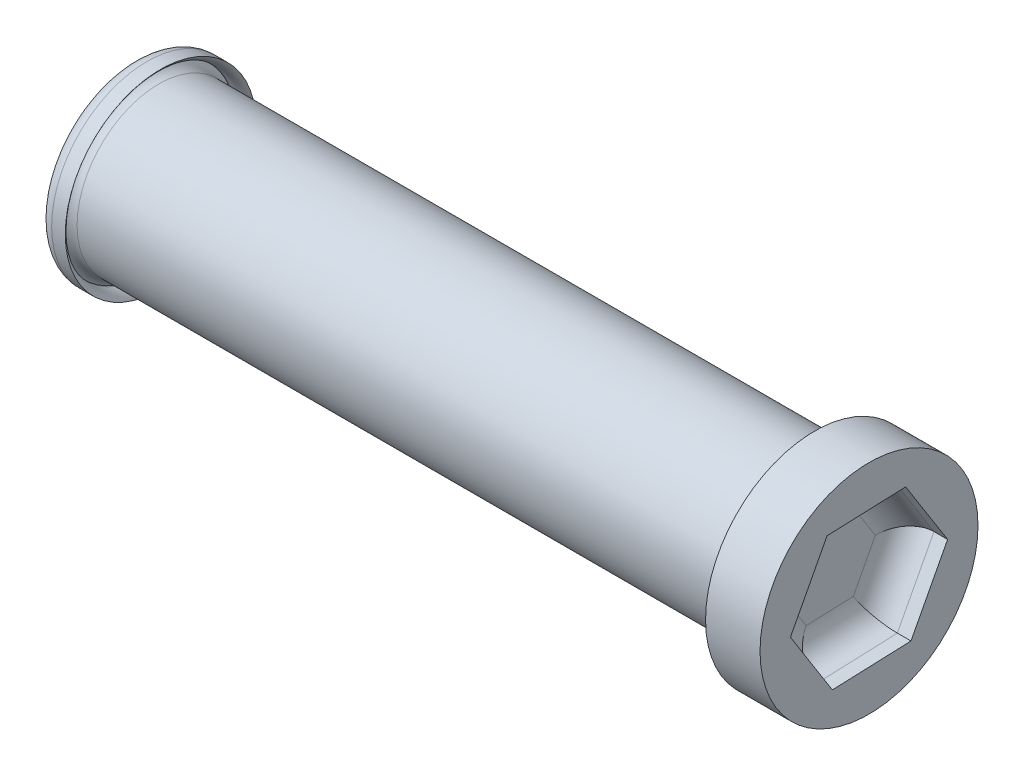
ISO-10303-21;
HEADER;
FILE_DESCRIPTION(('STEP AP214'),'2;1');
FILE_NAME('part.step','',(''),(''),'','','');
FILE_SCHEMA(('AUTOMOTIVE_DESIGN { 1 0 10303 214 1 1 1 1 }'));
ENDSEC;
DATA;
#1=APPLICATION_CONTEXT('core data for automotive mechanical design processes');
#2=APPLICATION_PROTOCOL_DEFINITION('international standard','automotive_design',2000,#1);
#3=PRODUCT_CONTEXT('',#1,'mechanical');
#4=PRODUCT('Part','Part','',(#3));
#5=PRODUCT_RELATED_PRODUCT_CATEGORY('part','',(#4));
#6=PRODUCT_DEFINITION_FORMATION('','',#4);
#7=PRODUCT_DEFINITION_CONTEXT('part definition',#1,'design');
#8=PRODUCT_DEFINITION('design','',#6,#7);
#9=PRODUCT_DEFINITION_SHAPE('','',#8);
#10=(LENGTH_UNIT() NAMED_UNIT(*) SI_UNIT(.MILLI.,.METRE.));
#11=(NAMED_UNIT(*) PLANE_ANGLE_UNIT() SI_UNIT($,.RADIAN.));
#12=(NAMED_UNIT(*) SI_UNIT($,.STERADIAN.) SOLID_ANGLE_UNIT());
#13=UNCERTAINTY_MEASURE_WITH_UNIT(LENGTH_MEASURE(1.E-05),#10,'distance_accuracy_value','');
#14=(GEOMETRIC_REPRESENTATION_CONTEXT(3) GLOBAL_UNCERTAINTY_ASSIGNED_CONTEXT((#13)) GLOBAL_UNIT_ASSIGNED_CONTEXT((#10,
#11,#12)) REPRESENTATION_CONTEXT('',''));
#15=CARTESIAN_POINT('',(0.,0.,0.));
#16=DIRECTION('',(0.,0.,1.));
#17=DIRECTION('',(1.,0.,0.));
#18=AXIS2_PLACEMENT_3D('',#15,#16,#17);
#19=CARTESIAN_POINT('',(0.,0.,0.));
#20=DIRECTION('',(1.,0.,0.));
#21=DIRECTION('',(0.,0.,-1.));
#22=AXIS2_PLACEMENT_3D('',#19,#20,#21);
#23=PLANE('',#22);
#24=CARTESIAN_POINT('',(0.,0.,0.));
#25=DIRECTION('',(1.,0.,0.));
#26=DIRECTION('',(0.,0.,-1.));
#27=AXIS2_PLACEMENT_3D('',#24,#25,#26);
#28=CIRCLE('',#27,3.5);
#29=CARTESIAN_POINT('',(0.,0.,-3.5));
#30=VERTEX_POINT('',#29);
#31=EDGE_CURVE('E155',#30,#30,#28,.T.);
#32=ORIENTED_EDGE('',*,*,#31,.T.);
#33=EDGE_LOOP('',(#32));
#34=FACE_BOUND('',#33,.T.);
#35=CARTESIAN_POINT('',(0.,0.,0.));
#36=DIRECTION('',(1.,0.,0.));
#37=DIRECTION('',(0.,0.,-1.));
#38=AXIS2_PLACEMENT_3D('',#35,#36,#37);
#39=CIRCLE('',#38,4.);
#40=CARTESIAN_POINT('',(0.,0.,-4.));
#41=VERTEX_POINT('',#40);
#42=EDGE_CURVE('E146',#41,#41,#39,.T.);
#43=ORIENTED_EDGE('',*,*,#42,.F.);
#44=EDGE_LOOP('',(#43));
#45=FACE_BOUND('',#44,.T.);
#46=ADVANCED_FACE('F32',(#34,#45),#23,.F.);
#47=CARTESIAN_POINT('',(2.,0.,0.));
#48=DIRECTION('',(1.,0.,0.));
#49=DIRECTION('',(0.,0.,-1.));
#50=AXIS2_PLACEMENT_3D('',#47,#48,#49);
#51=CYLINDRICAL_SURFACE('',#50,4.);
#52=CARTESIAN_POINT('',(2.,0.,0.));
#53=DIRECTION('',(1.,0.,0.));
#54=DIRECTION('',(0.,0.,-1.));
#55=AXIS2_PLACEMENT_3D('',#52,#53,#54);
#56=CIRCLE('',#55,4.);
#57=CARTESIAN_POINT('',(2.,0.,-4.));
#58=VERTEX_POINT('',#57);
#59=EDGE_CURVE('E137',#58,#58,#56,.T.);
#60=ORIENTED_EDGE('',*,*,#59,.F.);
#61=EDGE_LOOP('',(#60));
#62=FACE_BOUND('',#61,.T.);
#63=ORIENTED_EDGE('',*,*,#42,.T.);
#64=EDGE_LOOP('',(#63));
#65=FACE_BOUND('',#64,.T.);
#66=ADVANCED_FACE('F272',(#62,#65),#51,.T.);
#67=CARTESIAN_POINT('',(2.,4.,0.));
#68=DIRECTION('',(-1.,0.,0.));
#69=DIRECTION('',(0.,0.,1.));
#70=AXIS2_PLACEMENT_3D('',#67,#68,#69);
#71=PLANE('',#70);
#72=DIRECTION('',(0.,-0.0391108686359707,0.999234877270875));
#73=VECTOR('',#72,1.);
#74=CARTESIAN_POINT('',(2.,2.55453886951523,-1.34449414185008));
#75=LINE('',#74,#73);
#76=CARTESIAN_POINT('',(2.,2.55453886951523,-1.34449414185008));
#77=VERTEX_POINT('',#76);
#78=CARTESIAN_POINT('',(2.,2.44163551683914,1.54004848502993));
#79=VERTEX_POINT('',#78);
#80=EDGE_CURVE('E113',#77,#79,#75,.T.);
#81=ORIENTED_EDGE('',*,*,#80,.F.);
#82=DIRECTION('',(0.,0.845807353746018,0.533488444438264));
#83=VECTOR('',#82,1.);
#84=CARTESIAN_POINT('',(2.,0.112903352676089,-2.88454262688001));
#85=LINE('',#84,#83);
#86=CARTESIAN_POINT('',(2.,0.112903352676089,-2.88454262688001));
#87=VERTEX_POINT('',#86);
#88=EDGE_CURVE('E118',#87,#77,#85,.T.);
#89=ORIENTED_EDGE('',*,*,#88,.F.);
#90=DIRECTION('',(0.,0.884918222381988,-0.465746432832611));
#91=VECTOR('',#90,1.);
#92=CARTESIAN_POINT('',(2.,-2.44163551683914,-1.54004848502993));
#93=LINE('',#92,#91);
#94=CARTESIAN_POINT('',(2.,-2.44163551683914,-1.54004848502993));
#95=VERTEX_POINT('',#94);
#96=EDGE_CURVE('E132',#95,#87,#93,.T.);
#97=ORIENTED_EDGE('',*,*,#96,.F.);
#98=DIRECTION('',(0.,0.0391108686359705,-0.999234877270875));
#99=VECTOR('',#98,1.);
#100=CARTESIAN_POINT('',(2.,-2.55453886951523,1.34449414185008));
#101=LINE('',#100,#99);
#102=CARTESIAN_POINT('',(2.,-2.55453886951523,1.34449414185008));
#103=VERTEX_POINT('',#102);
#104=EDGE_CURVE('E126',#103,#95,#101,.T.);
#105=ORIENTED_EDGE('',*,*,#104,.F.);
#106=DIRECTION('',(0.,-0.845807353746018,-0.533488444438264));
#107=VECTOR('',#106,1.);
#108=CARTESIAN_POINT('',(2.,-0.112903352676088,2.88454262688001));
#109=LINE('',#108,#107);
#110=CARTESIAN_POINT('',(2.,-0.112903352676088,2.88454262688001));
#111=VERTEX_POINT('',#110);
#112=EDGE_CURVE('E124',#111,#103,#109,.T.);
#113=ORIENTED_EDGE('',*,*,#112,.F.);
#114=DIRECTION('',(0.,-0.884918222381988,0.465746432832611));
#115=VECTOR('',#114,1.);
#116=CARTESIAN_POINT('',(2.,2.44163551683914,1.54004848502993));
#117=LINE('',#116,#115);
#118=EDGE_CURVE('E106',#79,#111,#117,.T.);
#119=ORIENTED_EDGE('',*,*,#118,.F.);
#120=EDGE_LOOP('',(#81,#89,#97,#105,#113,#119));
#121=FACE_BOUND('',#120,.T.);
#122=ORIENTED_EDGE('',*,*,#59,.T.);
#123=EDGE_LOOP('',(#122));
#124=FACE_BOUND('',#123,.T.);
#125=ADVANCED_FACE('F120',(#121,#124),#71,.F.);
#126=CARTESIAN_POINT('',(-24.,0.,0.));
#127=DIRECTION('',(1.,0.,0.));
#128=DIRECTION('',(0.,0.,-1.));
#129=AXIS2_PLACEMENT_3D('',#126,#127,#128);
#130=CYLINDRICAL_SURFACE('',#129,3.);
#131=CARTESIAN_POINT('',(-24.0669872981078,0.,0.));
#132=DIRECTION('',(-1.,0.,0.));
#133=DIRECTION('',(0.,0.,1.));
#134=AXIS2_PLACEMENT_3D('',#131,#132,#133);
#135=CIRCLE('',#134,3.);
#136=CARTESIAN_POINT('',(-24.0669872981078,0.,3.));
#137=VERTEX_POINT('',#136);
#138=EDGE_CURVE('E152',#137,#137,#135,.F.);
#139=ORIENTED_EDGE('',*,*,#138,.T.);
#140=EDGE_LOOP('',(#139));
#141=FACE_BOUND('',#140,.T.);
#142=CARTESIAN_POINT('',(-0.5,0.,0.));
#143=DIRECTION('',(1.,0.,0.));
#144=DIRECTION('',(0.,0.,-1.));
#145=AXIS2_PLACEMENT_3D('',#142,#143,#144);
#146=CIRCLE('',#145,3.);
#147=CARTESIAN_POINT('',(-0.5,0.,-3.));
#148=VERTEX_POINT('',#147);
#149=EDGE_CURVE('E149',#148,#148,#146,.F.);
#150=ORIENTED_EDGE('',*,*,#149,.T.);
#151=EDGE_LOOP('',(#150));
#152=FACE_BOUND('',#151,.T.);
#153=ADVANCED_FACE('F376',(#141,#152),#130,.T.);
#154=CARTESIAN_POINT('',(0.5,0.112903352676089,-2.88454262688001));
#155=DIRECTION('',(0.,0.533488444438264,-0.845807353746018));
#156=DIRECTION('',(0.,0.845807353746018,0.533488444438264));
#157=AXIS2_PLACEMENT_3D('',#154,#155,#156);
#158=PLANE('',#157);
#159=DIRECTION('',(1.,0.,0.));
#160=VECTOR('',#159,1.);
#161=CARTESIAN_POINT('',(0.5,2.55453886951523,-1.34449414185008));
#162=LINE('',#161,#160);
#163=CARTESIAN_POINT('',(1.5,2.55453886951523,-1.34449414185008));
#164=VERTEX_POINT('',#163);
#165=EDGE_CURVE('E110',#164,#77,#162,.T.);
#166=ORIENTED_EDGE('',*,*,#165,.F.);
#167=DIRECTION('',(0.,0.845807353746018,0.533488444438264));
#168=VECTOR('',#167,1.);
#169=CARTESIAN_POINT('',(1.5,0.112903352676089,-2.88454262688001));
#170=LINE('',#169,#168);
#171=CARTESIAN_POINT('',(1.5,0.112903352676089,-2.88454262688001));
#172=VERTEX_POINT('',#171);
#173=EDGE_CURVE('E11',#164,#172,#170,.F.);
#174=ORIENTED_EDGE('',*,*,#173,.T.);
#175=DIRECTION('',(1.,0.,0.));
#176=VECTOR('',#175,1.);
#177=CARTESIAN_POINT('',(0.5,0.112903352676089,-2.88454262688001));
#178=LINE('',#177,#176);
#179=EDGE_CURVE('E135',#172,#87,#178,.T.);
#180=ORIENTED_EDGE('',*,*,#179,.T.);
#181=ORIENTED_EDGE('',*,*,#88,.T.);
#182=EDGE_LOOP('',(#166,#174,#180,#181));
#183=FACE_BOUND('',#182,.T.);
#184=ADVANCED_FACE('F225',(#183),#158,.F.);
#185=CARTESIAN_POINT('',(0.5,-2.44163551683914,-1.54004848502993));
#186=DIRECTION('',(0.,-0.465746432832611,-0.884918222381988));
#187=DIRECTION('',(0.,0.884918222381988,-0.465746432832611));
#188=AXIS2_PLACEMENT_3D('',#185,#186,#187);
#189=PLANE('',#188);
#190=ORIENTED_EDGE('',*,*,#179,.F.);
#191=DIRECTION('',(0.,0.884918222381988,-0.465746432832611));
#192=VECTOR('',#191,1.);
#193=CARTESIAN_POINT('',(1.5,-2.44163551683914,-1.54004848502993));
#194=LINE('',#193,#192);
#195=CARTESIAN_POINT('',(1.5,-2.44163551683914,-1.54004848502993));
#196=VERTEX_POINT('',#195);
#197=EDGE_CURVE('E186',#172,#196,#194,.F.);
#198=ORIENTED_EDGE('',*,*,#197,.T.);
#199=DIRECTION('',(1.,0.,0.));
#200=VECTOR('',#199,1.);
#201=CARTESIAN_POINT('',(0.5,-2.44163551683914,-1.54004848502993));
#202=LINE('',#201,#200);
#203=EDGE_CURVE('E138',#196,#95,#202,.T.);
#204=ORIENTED_EDGE('',*,*,#203,.T.);
#205=ORIENTED_EDGE('',*,*,#96,.T.);
#206=EDGE_LOOP('',(#190,#198,#204,#205));
#207=FACE_BOUND('',#206,.T.);
#208=ADVANCED_FACE('F230',(#207),#189,.F.);
#209=CARTESIAN_POINT('',(0.5,-2.55453886951523,1.34449414185008));
#210=DIRECTION('',(0.,-0.999234877270875,-0.0391108686359705));
#211=DIRECTION('',(0.,0.0391108686359705,-0.999234877270875));
#212=AXIS2_PLACEMENT_3D('',#209,#210,#211);
#213=PLANE('',#212);
#214=ORIENTED_EDGE('',*,*,#203,.F.);
#215=DIRECTION('',(0.,0.0391108686359705,-0.999234877270875));
#216=VECTOR('',#215,1.);
#217=CARTESIAN_POINT('',(1.5,-2.55453886951523,1.34449414185008));
#218=LINE('',#217,#216);
#219=CARTESIAN_POINT('',(1.5,-2.55453886951523,1.34449414185008));
#220=VERTEX_POINT('',#219);
#221=EDGE_CURVE('E189',#196,#220,#218,.F.);
#222=ORIENTED_EDGE('',*,*,#221,.T.);
#223=DIRECTION('',(1.,0.,0.));
#224=VECTOR('',#223,1.);
#225=CARTESIAN_POINT('',(0.5,-2.55453886951523,1.34449414185008));
#226=LINE('',#225,#224);
#227=EDGE_CURVE('E140',#220,#103,#226,.T.);
#228=ORIENTED_EDGE('',*,*,#227,.T.);
#229=ORIENTED_EDGE('',*,*,#104,.T.);
#230=EDGE_LOOP('',(#214,#222,#228,#229));
#231=FACE_BOUND('',#230,.T.);
#232=ADVANCED_FACE('F234',(#231),#213,.F.);
#233=CARTESIAN_POINT('',(0.5,-0.112903352676088,2.88454262688001));
#234=DIRECTION('',(0.,-0.533488444438264,0.845807353746018));
#235=DIRECTION('',(0.,-0.845807353746018,-0.533488444438264));
#236=AXIS2_PLACEMENT_3D('',#233,#234,#235);
#237=PLANE('',#236);
#238=ORIENTED_EDGE('',*,*,#227,.F.);
#239=DIRECTION('',(0.,-0.845807353746018,-0.533488444438264));
#240=VECTOR('',#239,1.);
#241=CARTESIAN_POINT('',(1.5,-0.112903352676088,2.88454262688001));
#242=LINE('',#241,#240);
#243=CARTESIAN_POINT('',(1.5,-0.112903352676088,2.88454262688001));
#244=VERTEX_POINT('',#243);
#245=EDGE_CURVE('E191',#220,#244,#242,.F.);
#246=ORIENTED_EDGE('',*,*,#245,.T.);
#247=DIRECTION('',(1.,0.,0.));
#248=VECTOR('',#247,1.);
#249=CARTESIAN_POINT('',(0.5,-0.112903352676088,2.88454262688001));
#250=LINE('',#249,#248);
#251=EDGE_CURVE('E109',#244,#111,#250,.T.);
#252=ORIENTED_EDGE('',*,*,#251,.T.);
#253=ORIENTED_EDGE('',*,*,#112,.T.);
#254=EDGE_LOOP('',(#238,#246,#252,#253));
#255=FACE_BOUND('',#254,.T.);
#256=ADVANCED_FACE('F238',(#255),#237,.F.);
#257=CARTESIAN_POINT('',(0.5,2.44163551683914,1.54004848502993));
#258=DIRECTION('',(0.,0.465746432832611,0.884918222381988));
#259=DIRECTION('',(0.,-0.884918222381989,0.465746432832611));
#260=AXIS2_PLACEMENT_3D('',#257,#258,#259);
#261=PLANE('',#260);
#262=ORIENTED_EDGE('',*,*,#251,.F.);
#263=DIRECTION('',(0.,-0.884918222381989,0.465746432832611));
#264=VECTOR('',#263,1.);
#265=CARTESIAN_POINT('',(1.5,2.44163551683914,1.54004848502993));
#266=LINE('',#265,#264);
#267=CARTESIAN_POINT('',(1.5,2.44163551683914,1.54004848502993));
#268=VERTEX_POINT('',#267);
#269=EDGE_CURVE('E56',#244,#268,#266,.F.);
#270=ORIENTED_EDGE('',*,*,#269,.T.);
#271=DIRECTION('',(1.,0.,0.));
#272=VECTOR('',#271,1.);
#273=CARTESIAN_POINT('',(0.5,2.44163551683914,1.54004848502993));
#274=LINE('',#273,#272);
#275=EDGE_CURVE('E102',#268,#79,#274,.T.);
#276=ORIENTED_EDGE('',*,*,#275,.T.);
#277=ORIENTED_EDGE('',*,*,#118,.T.);
#278=EDGE_LOOP('',(#262,#270,#276,#277));
#279=FACE_BOUND('',#278,.T.);
#280=ADVANCED_FACE('F104',(#279),#261,.F.);
#281=CARTESIAN_POINT('',(0.5,2.55453886951523,-1.34449414185008));
#282=DIRECTION('',(0.,0.999234877270875,0.0391108686359707));
#283=DIRECTION('',(0.,-0.0391108686359707,0.999234877270875));
#284=AXIS2_PLACEMENT_3D('',#281,#282,#283);
#285=PLANE('',#284);
#286=ORIENTED_EDGE('',*,*,#275,.F.);
#287=DIRECTION('',(0.,-0.0391108686359707,0.999234877270875));
#288=VECTOR('',#287,1.);
#289=CARTESIAN_POINT('',(1.5,2.55453886951523,-1.34449414185008));
#290=LINE('',#289,#288);
#291=EDGE_CURVE('E41',#268,#164,#290,.F.);
#292=ORIENTED_EDGE('',*,*,#291,.T.);
#293=ORIENTED_EDGE('',*,*,#165,.T.);
#294=ORIENTED_EDGE('',*,*,#80,.T.);
#295=EDGE_LOOP('',(#286,#292,#293,#294));
#296=FACE_BOUND('',#295,.T.);
#297=ADVANCED_FACE('F114',(#296),#285,.F.);
#298=CARTESIAN_POINT('',(0.5,0.,0.));
#299=DIRECTION('',(1.,0.,0.));
#300=DIRECTION('',(0.,0.,-1.));
#301=AXIS2_PLACEMENT_3D('',#298,#299,#300);
#302=PLANE('',#301);
#303=DIRECTION('',(0.,0.0391108686359705,-0.999234877270875));
#304=VECTOR('',#303,1.);
#305=CARTESIAN_POINT('',(0.5,-1.49885231590631,-0.0586663029539557));
#306=LINE('',#305,#304);
#307=CARTESIAN_POINT('',(0.5,-1.53272332170914,0.806696485110047));
#308=VERTEX_POINT('',#307);
#309=CARTESIAN_POINT('',(0.5,-1.46498131010349,-0.924029091017958));
#310=VERTEX_POINT('',#309);
#311=EDGE_CURVE('E181',#308,#310,#306,.T.);
#312=ORIENTED_EDGE('',*,*,#311,.T.);
#313=DIRECTION('',(0.,0.884918222381988,-0.465746432832611));
#314=VECTOR('',#313,1.);
#315=CARTESIAN_POINT('',(0.5,-0.698619649248916,-1.32737733357298));
#316=LINE('',#315,#314);
#317=CARTESIAN_POINT('',(0.5,0.0677420116056544,-1.73072557612801));
#318=VERTEX_POINT('',#317);
#319=EDGE_CURVE('E183',#310,#318,#316,.T.);
#320=ORIENTED_EDGE('',*,*,#319,.T.);
#321=DIRECTION('',(0.,0.845807353746018,0.533488444438264));
#322=VECTOR('',#321,1.);
#323=CARTESIAN_POINT('',(0.5,0.800232666657396,-1.26871103061903));
#324=LINE('',#323,#322);
#325=CARTESIAN_POINT('',(0.5,1.53272332170914,-0.806696485110048));
#326=VERTEX_POINT('',#325);
#327=EDGE_CURVE('E173',#318,#326,#324,.T.);
#328=ORIENTED_EDGE('',*,*,#327,.T.);
#329=DIRECTION('',(0.,-0.0391108686359707,0.999234877270875));
#330=VECTOR('',#329,1.);
#331=CARTESIAN_POINT('',(0.5,1.49885231590631,0.0586663029539561));
#332=LINE('',#331,#330);
#333=CARTESIAN_POINT('',(0.5,1.46498131010349,0.924029091017959));
#334=VERTEX_POINT('',#333);
#335=EDGE_CURVE('E175',#326,#334,#332,.T.);
#336=ORIENTED_EDGE('',*,*,#335,.T.);
#337=DIRECTION('',(0.,-0.884918222381989,0.465746432832611));
#338=VECTOR('',#337,1.);
#339=CARTESIAN_POINT('',(0.5,0.698619649248916,1.32737733357298));
#340=LINE('',#339,#338);
#341=CARTESIAN_POINT('',(0.5,-0.0677420116056529,1.73072557612801));
#342=VERTEX_POINT('',#341);
#343=EDGE_CURVE('E177',#334,#342,#340,.T.);
#344=ORIENTED_EDGE('',*,*,#343,.T.);
#345=DIRECTION('',(0.,-0.845807353746018,-0.533488444438264));
#346=VECTOR('',#345,1.);
#347=CARTESIAN_POINT('',(0.5,-0.800232666657396,1.26871103061903));
#348=LINE('',#347,#346);
#349=EDGE_CURVE('E179',#342,#308,#348,.T.);
#350=ORIENTED_EDGE('',*,*,#349,.T.);
#351=EDGE_LOOP('',(#312,#320,#328,#336,#344,#350));
#352=FACE_BOUND('',#351,.T.);
#353=ADVANCED_FACE('F257',(#352),#302,.T.);
#354=CARTESIAN_POINT('',(-24.5,0.,0.));
#355=DIRECTION('',(1.,0.,0.));
#356=DIRECTION('',(0.,0.,-1.));
#357=AXIS2_PLACEMENT_3D('',#354,#355,#356);
#358=CYLINDRICAL_SURFACE('',#357,3.25);
#359=CARTESIAN_POINT('',(-24.4330127018922,0.,0.));
#360=DIRECTION('',(1.,0.,0.));
#361=DIRECTION('',(0.,0.,-1.));
#362=AXIS2_PLACEMENT_3D('',#359,#360,#361);
#363=CIRCLE('',#362,3.25);
#364=CARTESIAN_POINT('',(-24.4330127018922,0.,-3.25));
#365=VERTEX_POINT('',#364);
#366=EDGE_CURVE('E170',#365,#365,#363,.T.);
#367=ORIENTED_EDGE('',*,*,#366,.T.);
#368=EDGE_LOOP('',(#367));
#369=FACE_BOUND('',#368,.T.);
#370=CARTESIAN_POINT('',(-24.5,0.,0.));
#371=DIRECTION('',(1.,0.,0.));
#372=DIRECTION('',(0.,0.,-1.));
#373=AXIS2_PLACEMENT_3D('',#370,#371,#372);
#374=CIRCLE('',#373,3.25);
#375=CARTESIAN_POINT('',(-24.5,0.,-3.25));
#376=VERTEX_POINT('',#375);
#377=EDGE_CURVE('E209',#376,#376,#374,.T.);
#378=ORIENTED_EDGE('',*,*,#377,.F.);
#379=EDGE_LOOP('',(#378));
#380=FACE_BOUND('',#379,.T.);
#381=ADVANCED_FACE('F259',(#369,#380),#358,.F.);
#382=CARTESIAN_POINT('',(-24.,0.,0.));
#383=DIRECTION('',(-1.,0.,0.));
#384=DIRECTION('',(0.,0.,1.));
#385=AXIS2_PLACEMENT_3D('',#382,#383,#384);
#386=PLANE('',#385);
#387=CARTESIAN_POINT('',(-24.,0.,0.));
#388=DIRECTION('',(-1.,0.,0.));
#389=DIRECTION('',(0.,0.,1.));
#390=AXIS2_PLACEMENT_3D('',#387,#388,#389);
#391=CIRCLE('',#390,2.);
#392=CARTESIAN_POINT('',(-24.,0.,2.));
#393=VERTEX_POINT('',#392);
#394=EDGE_CURVE('E158',#393,#393,#391,.T.);
#395=ORIENTED_EDGE('',*,*,#394,.T.);
#396=EDGE_LOOP('',(#395));
#397=FACE_BOUND('',#396,.T.);
#398=ADVANCED_FACE('F265',(#397),#386,.T.);
#399=CARTESIAN_POINT('',(-24.,0.,0.));
#400=DIRECTION('',(-1.,0.,0.));
#401=DIRECTION('',(0.,0.,1.));
#402=AXIS2_PLACEMENT_3D('',#399,#400,#401);
#403=CYLINDRICAL_SURFACE('',#402,2.5);
#404=CARTESIAN_POINT('',(-24.5,0.,0.));
#405=DIRECTION('',(-1.,0.,0.));
#406=DIRECTION('',(0.,0.,1.));
#407=AXIS2_PLACEMENT_3D('',#404,#405,#406);
#408=CIRCLE('',#407,2.5);
#409=CARTESIAN_POINT('',(-24.5,0.,2.5));
#410=VERTEX_POINT('',#409);
#411=EDGE_CURVE('E161',#410,#410,#408,.F.);
#412=ORIENTED_EDGE('',*,*,#411,.T.);
#413=EDGE_LOOP('',(#412));
#414=FACE_BOUND('',#413,.T.);
#415=CARTESIAN_POINT('',(-25.,0.,0.));
#416=DIRECTION('',(-1.,0.,0.));
#417=DIRECTION('',(0.,0.,1.));
#418=AXIS2_PLACEMENT_3D('',#415,#416,#417);
#419=CIRCLE('',#418,2.5);
#420=CARTESIAN_POINT('',(-25.,0.,2.5));
#421=VERTEX_POINT('',#420);
#422=EDGE_CURVE('E215',#421,#421,#419,.T.);
#423=ORIENTED_EDGE('',*,*,#422,.T.);
#424=EDGE_LOOP('',(#423));
#425=FACE_BOUND('',#424,.T.);
#426=ADVANCED_FACE('F350',(#414,#425),#403,.F.);
#427=CARTESIAN_POINT('',(-25.,0.,0.));
#428=DIRECTION('',(-1.,0.,0.));
#429=DIRECTION('',(0.,0.,1.));
#430=AXIS2_PLACEMENT_3D('',#427,#428,#429);
#431=PLANE('',#430);
#432=CARTESIAN_POINT('',(-25.,0.,0.));
#433=DIRECTION('',(-1.,0.,0.));
#434=DIRECTION('',(0.,0.,1.));
#435=AXIS2_PLACEMENT_3D('',#432,#433,#434);
#436=CIRCLE('',#435,3.);
#437=CARTESIAN_POINT('',(-25.,0.,3.));
#438=VERTEX_POINT('',#437);
#439=EDGE_CURVE('E164',#438,#438,#436,.T.);
#440=ORIENTED_EDGE('',*,*,#439,.T.);
#441=EDGE_LOOP('',(#440));
#442=FACE_BOUND('',#441,.T.);
#443=ORIENTED_EDGE('',*,*,#422,.F.);
#444=EDGE_LOOP('',(#443));
#445=FACE_BOUND('',#444,.T.);
#446=ADVANCED_FACE('F343',(#442,#445),#431,.T.);
#447=CARTESIAN_POINT('',(-25.,0.,0.));
#448=DIRECTION('',(1.,0.,0.));
#449=DIRECTION('',(0.,0.,-1.));
#450=AXIS2_PLACEMENT_3D('',#447,#448,#449);
#451=CYLINDRICAL_SURFACE('',#450,3.5);
#452=CARTESIAN_POINT('',(-24.5,0.,0.));
#453=DIRECTION('',(-1.,0.,0.));
#454=DIRECTION('',(0.,0.,1.));
#455=AXIS2_PLACEMENT_3D('',#452,#453,#454);
#456=CIRCLE('',#455,3.5);
#457=CARTESIAN_POINT('',(-24.5,0.,3.5));
#458=VERTEX_POINT('',#457);
#459=EDGE_CURVE('E167',#458,#458,#456,.F.);
#460=ORIENTED_EDGE('',*,*,#459,.T.);
#461=EDGE_LOOP('',(#460));
#462=FACE_BOUND('',#461,.T.);
#463=CARTESIAN_POINT('',(-24.,0.,0.));
#464=DIRECTION('',(-1.,0.,0.));
#465=DIRECTION('',(0.,0.,1.));
#466=AXIS2_PLACEMENT_3D('',#463,#464,#465);
#467=CIRCLE('',#466,3.5);
#468=CARTESIAN_POINT('',(-24.,0.,3.5));
#469=VERTEX_POINT('',#468);
#470=EDGE_CURVE('E220',#469,#469,#467,.T.);
#471=ORIENTED_EDGE('',*,*,#470,.T.);
#472=EDGE_LOOP('',(#471));
#473=FACE_BOUND('',#472,.T.);
#474=ADVANCED_FACE('F287',(#462,#473),#451,.T.);
#475=CARTESIAN_POINT('',(-24.0669872981078,0.,0.));
#476=DIRECTION('',(-1.,0.,0.));
#477=DIRECTION('',(0.,0.,1.));
#478=AXIS2_PLACEMENT_3D('',#475,#476,#477);
#479=TOROIDAL_SURFACE('',#478,3.5,0.5);
#480=ORIENTED_EDGE('',*,*,#377,.T.);
#481=EDGE_LOOP('',(#480));
#482=FACE_BOUND('',#481,.T.);
#483=ORIENTED_EDGE('',*,*,#138,.F.);
#484=EDGE_LOOP('',(#483));
#485=FACE_BOUND('',#484,.T.);
#486=ADVANCED_FACE('F283',(#482,#485),#479,.F.);
#487=CARTESIAN_POINT('',(-0.5,0.,0.));
#488=DIRECTION('',(1.,0.,0.));
#489=DIRECTION('',(0.,0.,-1.));
#490=AXIS2_PLACEMENT_3D('',#487,#488,#489);
#491=TOROIDAL_SURFACE('',#490,3.5,0.5);
#492=ORIENTED_EDGE('',*,*,#31,.F.);
#493=EDGE_LOOP('',(#492));
#494=FACE_BOUND('',#493,.T.);
#495=ORIENTED_EDGE('',*,*,#149,.F.);
#496=EDGE_LOOP('',(#495));
#497=FACE_BOUND('',#496,.T.);
#498=ADVANCED_FACE('F286',(#494,#497),#491,.F.);
#499=CARTESIAN_POINT('',(-24.5,0.,0.));
#500=DIRECTION('',(-1.,0.,0.));
#501=DIRECTION('',(0.,0.,1.));
#502=AXIS2_PLACEMENT_3D('',#499,#500,#501);
#503=TOROIDAL_SURFACE('',#502,2.,0.5);
#504=ORIENTED_EDGE('',*,*,#411,.F.);
#505=EDGE_LOOP('',(#504));
#506=FACE_BOUND('',#505,.T.);
#507=ORIENTED_EDGE('',*,*,#394,.F.);
#508=EDGE_LOOP('',(#507));
#509=FACE_BOUND('',#508,.T.);
#510=ADVANCED_FACE('F290',(#506,#509),#503,.F.);
#511=CARTESIAN_POINT('',(-24.5,0.,0.));
#512=DIRECTION('',(-1.,0.,0.));
#513=DIRECTION('',(0.,0.,1.));
#514=AXIS2_PLACEMENT_3D('',#511,#512,#513);
#515=TOROIDAL_SURFACE('',#514,3.,0.5);
#516=ORIENTED_EDGE('',*,*,#459,.F.);
#517=EDGE_LOOP('',(#516));
#518=FACE_BOUND('',#517,.T.);
#519=ORIENTED_EDGE('',*,*,#439,.F.);
#520=EDGE_LOOP('',(#519));
#521=FACE_BOUND('',#520,.T.);
#522=ADVANCED_FACE('F294',(#518,#521),#515,.T.);
#523=CARTESIAN_POINT('',(-24.4330127018922,0.,0.));
#524=DIRECTION('',(1.,0.,0.));
#525=DIRECTION('',(0.,0.,-1.));
#526=AXIS2_PLACEMENT_3D('',#523,#524,#525);
#527=TOROIDAL_SURFACE('',#526,3.75,0.5);
#528=ORIENTED_EDGE('',*,*,#470,.F.);
#529=EDGE_LOOP('',(#528));
#530=FACE_BOUND('',#529,.T.);
#531=ORIENTED_EDGE('',*,*,#366,.F.);
#532=EDGE_LOOP('',(#531));
#533=FACE_BOUND('',#532,.T.);
#534=ADVANCED_FACE('F298',(#530,#533),#527,.T.);
#535=CARTESIAN_POINT('',(1.5,0.698619649248916,1.32737733357298));
#536=DIRECTION('',(0.,-0.884918222381989,0.465746432832611));
#537=DIRECTION('',(0.,-0.465746432832611,-0.884918222381989));
#538=AXIS2_PLACEMENT_3D('',#535,#536,#537);
#539=CYLINDRICAL_SURFACE('',#538,1.);
#540=CARTESIAN_POINT('',(1.5,1.46498131010349,0.924029091017959));
#541=DIRECTION('',(0.,-0.533488444438264,0.845807353746018));
#542=DIRECTION('',(0.,-0.845807353746018,-0.533488444438264));
#543=AXIS2_PLACEMENT_3D('',#540,#541,#542);
#544=ELLIPSE('',#543,1.15470053837925,1.);
#545=EDGE_CURVE('E204',#268,#334,#544,.T.);
#546=ORIENTED_EDGE('',*,*,#545,.F.);
#547=ORIENTED_EDGE('',*,*,#269,.F.);
#548=CARTESIAN_POINT('',(1.5,-0.0677420116056533,1.73072557612801));
#549=DIRECTION('',(0.,-0.999234877270875,-0.0391108686359705));
#550=DIRECTION('',(0.,0.0391108686359707,-0.999234877270875));
#551=AXIS2_PLACEMENT_3D('',#548,#549,#550);
#552=ELLIPSE('',#551,1.15470053837925,1.);
#553=EDGE_CURVE('E36',#342,#244,#552,.F.);
#554=ORIENTED_EDGE('',*,*,#553,.F.);
#555=ORIENTED_EDGE('',*,*,#343,.F.);
#556=EDGE_LOOP('',(#546,#547,#554,#555));
#557=FACE_BOUND('',#556,.T.);
#558=ADVANCED_FACE('F34',(#557),#539,.F.);
#559=CARTESIAN_POINT('',(1.5,-0.800232666657396,1.26871103061903));
#560=DIRECTION('',(0.,-0.845807353746018,-0.533488444438264));
#561=DIRECTION('',(0.,0.533488444438264,-0.845807353746018));
#562=AXIS2_PLACEMENT_3D('',#559,#560,#561);
#563=CYLINDRICAL_SURFACE('',#562,1.);
#564=ORIENTED_EDGE('',*,*,#553,.T.);
#565=ORIENTED_EDGE('',*,*,#245,.F.);
#566=CARTESIAN_POINT('',(1.5,-1.53272332170914,0.806696485110047));
#567=DIRECTION('',(0.,-0.465746432832611,-0.884918222381988));
#568=DIRECTION('',(0.,0.884918222381988,-0.465746432832611));
#569=AXIS2_PLACEMENT_3D('',#566,#567,#568);
#570=ELLIPSE('',#569,1.15470053837925,1.);
#571=EDGE_CURVE('E202',#308,#220,#570,.F.);
#572=ORIENTED_EDGE('',*,*,#571,.F.);
#573=ORIENTED_EDGE('',*,*,#349,.F.);
#574=EDGE_LOOP('',(#564,#565,#572,#573));
#575=FACE_BOUND('',#574,.T.);
#576=ADVANCED_FACE('F255',(#575),#563,.F.);
#577=CARTESIAN_POINT('',(1.5,1.49885231590631,0.0586663029539561));
#578=DIRECTION('',(0.,-0.0391108686359707,0.999234877270875));
#579=DIRECTION('',(0.,-0.999234877270875,-0.0391108686359707));
#580=AXIS2_PLACEMENT_3D('',#577,#578,#579);
#581=CYLINDRICAL_SURFACE('',#580,1.);
#582=ORIENTED_EDGE('',*,*,#545,.T.);
#583=ORIENTED_EDGE('',*,*,#335,.F.);
#584=CARTESIAN_POINT('',(1.5,1.53272332170914,-0.806696485110048));
#585=DIRECTION('',(0.,0.465746432832611,0.884918222381989));
#586=DIRECTION('',(0.,-0.884918222381988,0.465746432832611));
#587=AXIS2_PLACEMENT_3D('',#584,#585,#586);
#588=ELLIPSE('',#587,1.15470053837925,1.);
#589=EDGE_CURVE('E199',#164,#326,#588,.T.);
#590=ORIENTED_EDGE('',*,*,#589,.F.);
#591=ORIENTED_EDGE('',*,*,#291,.F.);
#592=EDGE_LOOP('',(#582,#583,#590,#591));
#593=FACE_BOUND('',#592,.T.);
#594=ADVANCED_FACE('F241',(#593),#581,.F.);
#595=CARTESIAN_POINT('',(1.5,-1.49885231590631,-0.0586663029539557));
#596=DIRECTION('',(0.,0.0391108686359705,-0.999234877270875));
#597=DIRECTION('',(0.,0.999234877270875,0.0391108686359705));
#598=AXIS2_PLACEMENT_3D('',#595,#596,#597);
#599=CYLINDRICAL_SURFACE('',#598,1.);
#600=ORIENTED_EDGE('',*,*,#571,.T.);
#601=ORIENTED_EDGE('',*,*,#221,.F.);
#602=CARTESIAN_POINT('',(1.5,-1.46498131010349,-0.924029091017959));
#603=DIRECTION('',(0.,0.533488444438264,-0.845807353746018));
#604=DIRECTION('',(0.,0.845807353746018,0.533488444438264));
#605=AXIS2_PLACEMENT_3D('',#602,#603,#604);
#606=ELLIPSE('',#605,1.15470053837925,1.);
#607=EDGE_CURVE('E197',#310,#196,#606,.F.);
#608=ORIENTED_EDGE('',*,*,#607,.F.);
#609=ORIENTED_EDGE('',*,*,#311,.F.);
#610=EDGE_LOOP('',(#600,#601,#608,#609));
#611=FACE_BOUND('',#610,.T.);
#612=ADVANCED_FACE('F253',(#611),#599,.F.);
#613=CARTESIAN_POINT('',(1.5,0.800232666657396,-1.26871103061903));
#614=DIRECTION('',(0.,0.845807353746018,0.533488444438264));
#615=DIRECTION('',(0.,-0.533488444438264,0.845807353746018));
#616=AXIS2_PLACEMENT_3D('',#613,#614,#615);
#617=CYLINDRICAL_SURFACE('',#616,1.);
#618=ORIENTED_EDGE('',*,*,#589,.T.);
#619=ORIENTED_EDGE('',*,*,#327,.F.);
#620=CARTESIAN_POINT('',(1.5,0.0677420116056539,-1.73072557612801));
#621=DIRECTION('',(0.,0.999234877270875,0.0391108686359705));
#622=DIRECTION('',(0.,0.0391108686359705,-0.999234877270875));
#623=AXIS2_PLACEMENT_3D('',#620,#621,#622);
#624=ELLIPSE('',#623,1.15470053837925,1.);
#625=EDGE_CURVE('E195',#172,#318,#624,.T.);
#626=ORIENTED_EDGE('',*,*,#625,.F.);
#627=ORIENTED_EDGE('',*,*,#173,.F.);
#628=EDGE_LOOP('',(#618,#619,#626,#627));
#629=FACE_BOUND('',#628,.T.);
#630=ADVANCED_FACE('F246',(#629),#617,.F.);
#631=CARTESIAN_POINT('',(1.5,-0.698619649248916,-1.32737733357298));
#632=DIRECTION('',(0.,0.884918222381988,-0.465746432832611));
#633=DIRECTION('',(0.,0.465746432832611,0.884918222381988));
#634=AXIS2_PLACEMENT_3D('',#631,#632,#633);
#635=CYLINDRICAL_SURFACE('',#634,1.);
#636=ORIENTED_EDGE('',*,*,#607,.T.);
#637=ORIENTED_EDGE('',*,*,#197,.F.);
#638=ORIENTED_EDGE('',*,*,#625,.T.);
#639=ORIENTED_EDGE('',*,*,#319,.F.);
#640=EDGE_LOOP('',(#636,#637,#638,#639));
#641=FACE_BOUND('',#640,.T.);
#642=ADVANCED_FACE('F249',(#641),#635,.F.);
#643=CLOSED_SHELL('',(#46,#66,#125,#153,#184,#208,#232,#256,#280,#297,#353,#381,#398,#426,#446,
#474,#486,#498,#510,#522,#534,#558,#576,#594,#612,#630,#642));
#644=MANIFOLD_SOLID_BREP('B2',#643);
#645=ADVANCED_BREP_SHAPE_REPRESENTATION('',(#18,#644),#14);
#646=SHAPE_DEFINITION_REPRESENTATION(#9,#645);
ENDSEC;
END-ISO-10303-21;
